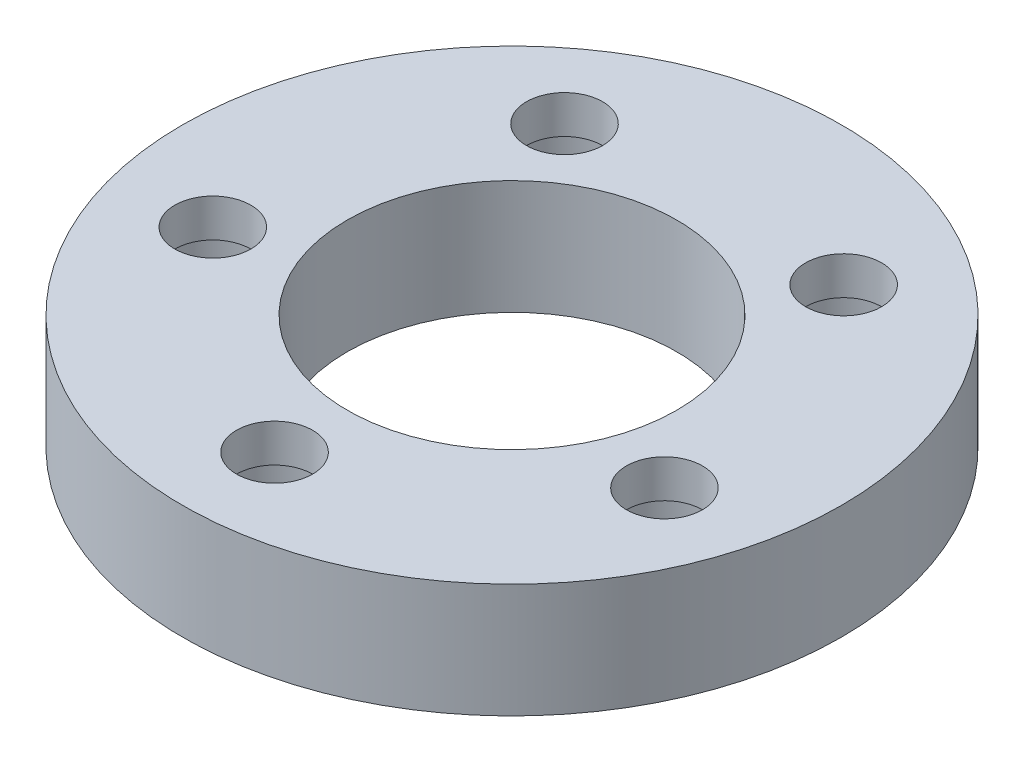
ISO-10303-21;
HEADER;
FILE_DESCRIPTION(('STEP AP214'),'2;1');
FILE_NAME('part.step','',(''),(''),'','','');
FILE_SCHEMA(('AUTOMOTIVE_DESIGN { 1 0 10303 214 1 1 1 1 }'));
ENDSEC;
DATA;
#1=APPLICATION_CONTEXT('core data for automotive mechanical design processes');
#2=APPLICATION_PROTOCOL_DEFINITION('international standard','automotive_design',2000,#1);
#3=PRODUCT_CONTEXT('',#1,'mechanical');
#4=PRODUCT('Part','Part','',(#3));
#5=PRODUCT_RELATED_PRODUCT_CATEGORY('part','',(#4));
#6=PRODUCT_DEFINITION_FORMATION('','',#4);
#7=PRODUCT_DEFINITION_CONTEXT('part definition',#1,'design');
#8=PRODUCT_DEFINITION('design','',#6,#7);
#9=PRODUCT_DEFINITION_SHAPE('','',#8);
#10=(LENGTH_UNIT() NAMED_UNIT(*) SI_UNIT(.MILLI.,.METRE.));
#11=(NAMED_UNIT(*) PLANE_ANGLE_UNIT() SI_UNIT($,.RADIAN.));
#12=(NAMED_UNIT(*) SI_UNIT($,.STERADIAN.) SOLID_ANGLE_UNIT());
#13=UNCERTAINTY_MEASURE_WITH_UNIT(LENGTH_MEASURE(1.E-05),#10,'distance_accuracy_value','');
#14=(GEOMETRIC_REPRESENTATION_CONTEXT(3) GLOBAL_UNCERTAINTY_ASSIGNED_CONTEXT((#13)) GLOBAL_UNIT_ASSIGNED_CONTEXT((#10,
#11,#12)) REPRESENTATION_CONTEXT('',''));
#15=CARTESIAN_POINT('',(0.,0.,0.));
#16=DIRECTION('',(0.,0.,1.));
#17=DIRECTION('',(1.,0.,0.));
#18=AXIS2_PLACEMENT_3D('',#15,#16,#17);
#19=CARTESIAN_POINT('',(-15.0742457832777,-25.337212190987,4.89791936084227));
#20=DIRECTION('',(0.,-1.,0.));
#21=DIRECTION('',(1.,0.,0.));
#22=AXIS2_PLACEMENT_3D('',#19,#20,#21);
#23=CYLINDRICAL_SURFACE('',#22,2.54000000000081);
#24=CARTESIAN_POINT('',(-15.0742457832777,-25.337212190987,4.89791936084227));
#25=DIRECTION('',(0.,-1.,0.));
#26=DIRECTION('',(1.,0.,0.));
#27=AXIS2_PLACEMENT_3D('',#24,#25,#26);
#28=CIRCLE('',#27,2.54000000000081);
#29=CARTESIAN_POINT('',(-12.5342457832769,-25.337212190987,4.89791936084227));
#30=VERTEX_POINT('',#29);
#31=EDGE_CURVE('E52',#30,#30,#28,.T.);
#32=CARTESIAN_POINT('',(-15.0742457832777,-27.877212190987,4.89791936084227));
#33=DIRECTION('',(0.,-1.,0.));
#34=DIRECTION('',(1.,0.,0.));
#35=AXIS2_PLACEMENT_3D('',#32,#33,#34);
#36=CIRCLE('',#35,2.54000000000081);
#37=CARTESIAN_POINT('',(-12.5342457832769,-27.877212190987,4.89791936084227));
#38=VERTEX_POINT('',#37);
#39=EDGE_CURVE('E36',#38,#38,#36,.F.);
#40=CARTESIAN_POINT('',(-12.5342457832769,-25.337212190987,4.89791936084227));
#41=CARTESIAN_POINT('',(-12.5342457832769,-25.3636705243203,4.89791936084227));
#42=CARTESIAN_POINT('',(-12.5342457832769,-25.3901288576536,4.89791936084227));
#43=CARTESIAN_POINT('',(-12.5342457832769,-25.4430455243203,4.89791936084227));
#44=CARTESIAN_POINT('',(-12.5342457832769,-25.4695038576536,4.89791936084227));
#45=CARTESIAN_POINT('',(-12.5342457832769,-25.5224205243203,4.89791936084227));
#46=CARTESIAN_POINT('',(-12.5342457832769,-25.5488788576536,4.89791936084227));
#47=CARTESIAN_POINT('',(-12.5342457832769,-25.6017955243203,4.89791936084227));
#48=CARTESIAN_POINT('',(-12.5342457832769,-25.6282538576536,4.89791936084227));
#49=CARTESIAN_POINT('',(-12.5342457832769,-25.6811705243203,4.89791936084227));
#50=CARTESIAN_POINT('',(-12.5342457832769,-25.7076288576536,4.89791936084227));
#51=CARTESIAN_POINT('',(-12.5342457832769,-25.7605455243203,4.89791936084227));
#52=CARTESIAN_POINT('',(-12.5342457832769,-25.7870038576536,4.89791936084227));
#53=CARTESIAN_POINT('',(-12.5342457832769,-25.8399205243203,4.89791936084227));
#54=CARTESIAN_POINT('',(-12.5342457832769,-25.8663788576536,4.89791936084227));
#55=CARTESIAN_POINT('',(-12.5342457832769,-25.9192955243203,4.89791936084227));
#56=CARTESIAN_POINT('',(-12.5342457832769,-25.9457538576536,4.89791936084227));
#57=CARTESIAN_POINT('',(-12.5342457832769,-25.9986705243203,4.89791936084227));
#58=CARTESIAN_POINT('',(-12.5342457832769,-26.0251288576536,4.89791936084227));
#59=CARTESIAN_POINT('',(-12.5342457832769,-26.0780455243203,4.89791936084227));
#60=CARTESIAN_POINT('',(-12.5342457832769,-26.1045038576536,4.89791936084227));
#61=CARTESIAN_POINT('',(-12.5342457832769,-26.1574205243203,4.89791936084227));
#62=CARTESIAN_POINT('',(-12.5342457832769,-26.1838788576536,4.89791936084227));
#63=CARTESIAN_POINT('',(-12.5342457832769,-26.2367955243203,4.89791936084227));
#64=CARTESIAN_POINT('',(-12.5342457832769,-26.2632538576536,4.89791936084227));
#65=CARTESIAN_POINT('',(-12.5342457832769,-26.3161705243203,4.89791936084227));
#66=CARTESIAN_POINT('',(-12.5342457832769,-26.3426288576536,4.89791936084227));
#67=CARTESIAN_POINT('',(-12.5342457832769,-26.3955455243203,4.89791936084227));
#68=CARTESIAN_POINT('',(-12.5342457832769,-26.4220038576536,4.89791936084227));
#69=CARTESIAN_POINT('',(-12.5342457832769,-26.4749205243203,4.89791936084227));
#70=CARTESIAN_POINT('',(-12.5342457832769,-26.5013788576536,4.89791936084227));
#71=CARTESIAN_POINT('',(-12.5342457832769,-26.5542955243203,4.89791936084227));
#72=CARTESIAN_POINT('',(-12.5342457832769,-26.5807538576536,4.89791936084227));
#73=CARTESIAN_POINT('',(-12.5342457832769,-26.6336705243203,4.89791936084227));
#74=CARTESIAN_POINT('',(-12.5342457832769,-26.6601288576536,4.89791936084227));
#75=CARTESIAN_POINT('',(-12.5342457832769,-26.7130455243203,4.89791936084227));
#76=CARTESIAN_POINT('',(-12.5342457832769,-26.7395038576536,4.89791936084227));
#77=CARTESIAN_POINT('',(-12.5342457832769,-26.7924205243203,4.89791936084227));
#78=CARTESIAN_POINT('',(-12.5342457832769,-26.8188788576536,4.89791936084227));
#79=CARTESIAN_POINT('',(-12.5342457832769,-26.8717955243203,4.89791936084227));
#80=CARTESIAN_POINT('',(-12.5342457832769,-26.8982538576536,4.89791936084227));
#81=CARTESIAN_POINT('',(-12.5342457832769,-26.9511705243203,4.89791936084227));
#82=CARTESIAN_POINT('',(-12.5342457832769,-26.9776288576536,4.89791936084227));
#83=CARTESIAN_POINT('',(-12.5342457832769,-27.0305455243203,4.89791936084227));
#84=CARTESIAN_POINT('',(-12.5342457832769,-27.0570038576536,4.89791936084227));
#85=CARTESIAN_POINT('',(-12.5342457832769,-27.1099205243203,4.89791936084227));
#86=CARTESIAN_POINT('',(-12.5342457832769,-27.1363788576536,4.89791936084227));
#87=CARTESIAN_POINT('',(-12.5342457832769,-27.1892955243203,4.89791936084227));
#88=CARTESIAN_POINT('',(-12.5342457832769,-27.2157538576536,4.89791936084227));
#89=CARTESIAN_POINT('',(-12.5342457832769,-27.2686705243203,4.89791936084227));
#90=CARTESIAN_POINT('',(-12.5342457832769,-27.2951288576536,4.89791936084227));
#91=CARTESIAN_POINT('',(-12.5342457832769,-27.3480455243203,4.89791936084227));
#92=CARTESIAN_POINT('',(-12.5342457832769,-27.3745038576536,4.89791936084227));
#93=CARTESIAN_POINT('',(-12.5342457832769,-27.4274205243203,4.89791936084227));
#94=CARTESIAN_POINT('',(-12.5342457832769,-27.4538788576536,4.89791936084227));
#95=CARTESIAN_POINT('',(-12.5342457832769,-27.5067955243203,4.89791936084227));
#96=CARTESIAN_POINT('',(-12.5342457832769,-27.5332538576536,4.89791936084227));
#97=CARTESIAN_POINT('',(-12.5342457832769,-27.5861705243203,4.89791936084227));
#98=CARTESIAN_POINT('',(-12.5342457832769,-27.6126288576536,4.89791936084227));
#99=CARTESIAN_POINT('',(-12.5342457832769,-27.6655455243203,4.89791936084227));
#100=CARTESIAN_POINT('',(-12.5342457832769,-27.6920038576536,4.89791936084227));
#101=CARTESIAN_POINT('',(-12.5342457832769,-27.7449205243203,4.89791936084227));
#102=CARTESIAN_POINT('',(-12.5342457832769,-27.7713788576536,4.89791936084227));
#103=CARTESIAN_POINT('',(-12.5342457832769,-27.8242955243203,4.89791936084227));
#104=CARTESIAN_POINT('',(-12.5342457832769,-27.8507538576536,4.89791936084227));
#105=CARTESIAN_POINT('',(-12.5342457832769,-27.877212190987,4.89791936084227));
#106=B_SPLINE_CURVE_WITH_KNOTS('',3,(#40,#41,#42,#43,#44,#45,#46,#47,#48,#49,#50,#51,#52,#53,
#54,#55,#56,#57,#58,#59,#60,#61,#62,#63,#64,#65,#66,#67,#68,#69,#70,#71,#72,#73,#74,#75,#76,#77,
#78,#79,#80,#81,#82,#83,#84,#85,#86,#87,#88,#89,#90,#91,#92,#93,#94,#95,#96,#97,#98,#99,#100,
#101,#102,#103,#104,#105),.UNSPECIFIED.,.F.,.F.,(4,2,2,2,2,2,2,2,2,2,2,2,2,2,2,2,2,2,2,2,2,2,2,
2,2,2,2,2,2,2,2,2,4),(0.,0.0793749999999996,0.158749999999999,0.238124999999999,
0.317499999999998,0.396874999999998,0.476249999999998,0.555624999999997,0.634999999999997,
0.714374999999996,0.793749999999996,0.873124999999999,0.952499999999998,1.031875,1.11125,
1.190625,1.27,1.349375,1.42875,1.508125,1.5875,1.66687499999999,1.74624999999999,1.825625,1.905,
1.984375,2.06375,2.143125,2.2225,2.301875,2.38124999999999,2.46062499999999,2.53999999999999),.UNSPECIFIED.);
#107=EDGE_CURVE('BSEAM32',#30,#38,#106,.T.);
#108=ORIENTED_EDGE('',*,*,#31,.F.);
#109=ORIENTED_EDGE('',*,*,#39,.F.);
#110=ORIENTED_EDGE('',*,*,#107,.T.);
#111=ORIENTED_EDGE('',*,*,#107,.F.);
#112=EDGE_LOOP('',(#108,#110,#109,#111));
#113=FACE_BOUND('',#112,.T.);
#114=ADVANCED_FACE('F32',(#113),#23,.F.);
#115=CARTESIAN_POINT('',(-9.31639624883447,-25.337212190987,-12.8229193608433));
#116=DIRECTION('',(0.,-1.,0.));
#117=DIRECTION('',(1.,0.,0.));
#118=AXIS2_PLACEMENT_3D('',#115,#116,#117);
#119=CYLINDRICAL_SURFACE('',#118,2.54000000000142);
#120=CARTESIAN_POINT('',(-9.31639624883447,-25.337212190987,-12.8229193608433));
#121=DIRECTION('',(0.,-1.,0.));
#122=DIRECTION('',(1.,0.,0.));
#123=AXIS2_PLACEMENT_3D('',#120,#121,#122);
#124=CIRCLE('',#123,2.54000000000142);
#125=CARTESIAN_POINT('',(-6.77639624883305,-25.337212190987,-12.8229193608433));
#126=VERTEX_POINT('',#125);
#127=EDGE_CURVE('E94',#126,#126,#124,.T.);
#128=CARTESIAN_POINT('',(-9.31639624883447,-27.877212190987,-12.8229193608433));
#129=DIRECTION('',(0.,-1.,0.));
#130=DIRECTION('',(1.,0.,0.));
#131=AXIS2_PLACEMENT_3D('',#128,#129,#130);
#132=CIRCLE('',#131,2.54000000000142);
#133=CARTESIAN_POINT('',(-6.77639624883305,-27.877212190987,-12.8229193608433));
#134=VERTEX_POINT('',#133);
#135=EDGE_CURVE('E63',#134,#134,#132,.F.);
#136=CARTESIAN_POINT('',(-6.77639624883305,-25.337212190987,-12.8229193608433));
#137=CARTESIAN_POINT('',(-6.77639624883305,-25.3636705243203,-12.8229193608433));
#138=CARTESIAN_POINT('',(-6.77639624883305,-25.3901288576536,-12.8229193608433));
#139=CARTESIAN_POINT('',(-6.77639624883305,-25.4430455243203,-12.8229193608433));
#140=CARTESIAN_POINT('',(-6.77639624883305,-25.4695038576536,-12.8229193608433));
#141=CARTESIAN_POINT('',(-6.77639624883305,-25.5224205243203,-12.8229193608433));
#142=CARTESIAN_POINT('',(-6.77639624883305,-25.5488788576536,-12.8229193608433));
#143=CARTESIAN_POINT('',(-6.77639624883305,-25.6017955243203,-12.8229193608433));
#144=CARTESIAN_POINT('',(-6.77639624883305,-25.6282538576536,-12.8229193608433));
#145=CARTESIAN_POINT('',(-6.77639624883305,-25.6811705243203,-12.8229193608433));
#146=CARTESIAN_POINT('',(-6.77639624883305,-25.7076288576536,-12.8229193608433));
#147=CARTESIAN_POINT('',(-6.77639624883305,-25.7605455243203,-12.8229193608433));
#148=CARTESIAN_POINT('',(-6.77639624883305,-25.7870038576536,-12.8229193608433));
#149=CARTESIAN_POINT('',(-6.77639624883305,-25.8399205243203,-12.8229193608433));
#150=CARTESIAN_POINT('',(-6.77639624883305,-25.8663788576536,-12.8229193608433));
#151=CARTESIAN_POINT('',(-6.77639624883305,-25.9192955243203,-12.8229193608433));
#152=CARTESIAN_POINT('',(-6.77639624883305,-25.9457538576536,-12.8229193608433));
#153=CARTESIAN_POINT('',(-6.77639624883305,-25.9986705243203,-12.8229193608433));
#154=CARTESIAN_POINT('',(-6.77639624883305,-26.0251288576536,-12.8229193608433));
#155=CARTESIAN_POINT('',(-6.77639624883305,-26.0780455243203,-12.8229193608433));
#156=CARTESIAN_POINT('',(-6.77639624883305,-26.1045038576536,-12.8229193608433));
#157=CARTESIAN_POINT('',(-6.77639624883305,-26.1574205243203,-12.8229193608433));
#158=CARTESIAN_POINT('',(-6.77639624883305,-26.1838788576536,-12.8229193608433));
#159=CARTESIAN_POINT('',(-6.77639624883305,-26.2367955243203,-12.8229193608433));
#160=CARTESIAN_POINT('',(-6.77639624883305,-26.2632538576536,-12.8229193608433));
#161=CARTESIAN_POINT('',(-6.77639624883305,-26.3161705243203,-12.8229193608433));
#162=CARTESIAN_POINT('',(-6.77639624883305,-26.3426288576536,-12.8229193608433));
#163=CARTESIAN_POINT('',(-6.77639624883305,-26.3955455243203,-12.8229193608433));
#164=CARTESIAN_POINT('',(-6.77639624883305,-26.4220038576536,-12.8229193608433));
#165=CARTESIAN_POINT('',(-6.77639624883305,-26.4749205243203,-12.8229193608433));
#166=CARTESIAN_POINT('',(-6.77639624883305,-26.5013788576536,-12.8229193608433));
#167=CARTESIAN_POINT('',(-6.77639624883305,-26.5542955243203,-12.8229193608433));
#168=CARTESIAN_POINT('',(-6.77639624883305,-26.5807538576536,-12.8229193608433));
#169=CARTESIAN_POINT('',(-6.77639624883305,-26.6336705243203,-12.8229193608433));
#170=CARTESIAN_POINT('',(-6.77639624883305,-26.6601288576536,-12.8229193608433));
#171=CARTESIAN_POINT('',(-6.77639624883305,-26.7130455243203,-12.8229193608433));
#172=CARTESIAN_POINT('',(-6.77639624883305,-26.7395038576536,-12.8229193608433));
#173=CARTESIAN_POINT('',(-6.77639624883305,-26.7924205243203,-12.8229193608433));
#174=CARTESIAN_POINT('',(-6.77639624883305,-26.8188788576536,-12.8229193608433));
#175=CARTESIAN_POINT('',(-6.77639624883305,-26.8717955243203,-12.8229193608433));
#176=CARTESIAN_POINT('',(-6.77639624883305,-26.8982538576536,-12.8229193608433));
#177=CARTESIAN_POINT('',(-6.77639624883305,-26.9511705243203,-12.8229193608433));
#178=CARTESIAN_POINT('',(-6.77639624883305,-26.9776288576536,-12.8229193608433));
#179=CARTESIAN_POINT('',(-6.77639624883305,-27.0305455243203,-12.8229193608433));
#180=CARTESIAN_POINT('',(-6.77639624883305,-27.0570038576536,-12.8229193608433));
#181=CARTESIAN_POINT('',(-6.77639624883305,-27.1099205243203,-12.8229193608433));
#182=CARTESIAN_POINT('',(-6.77639624883305,-27.1363788576536,-12.8229193608433));
#183=CARTESIAN_POINT('',(-6.77639624883305,-27.1892955243203,-12.8229193608433));
#184=CARTESIAN_POINT('',(-6.77639624883305,-27.2157538576536,-12.8229193608433));
#185=CARTESIAN_POINT('',(-6.77639624883305,-27.2686705243203,-12.8229193608433));
#186=CARTESIAN_POINT('',(-6.77639624883305,-27.2951288576536,-12.8229193608433));
#187=CARTESIAN_POINT('',(-6.77639624883305,-27.3480455243203,-12.8229193608433));
#188=CARTESIAN_POINT('',(-6.77639624883305,-27.3745038576536,-12.8229193608433));
#189=CARTESIAN_POINT('',(-6.77639624883305,-27.4274205243203,-12.8229193608433));
#190=CARTESIAN_POINT('',(-6.77639624883305,-27.4538788576536,-12.8229193608433));
#191=CARTESIAN_POINT('',(-6.77639624883305,-27.5067955243203,-12.8229193608433));
#192=CARTESIAN_POINT('',(-6.77639624883305,-27.5332538576536,-12.8229193608433));
#193=CARTESIAN_POINT('',(-6.77639624883305,-27.5861705243203,-12.8229193608433));
#194=CARTESIAN_POINT('',(-6.77639624883305,-27.6126288576536,-12.8229193608433));
#195=CARTESIAN_POINT('',(-6.77639624883305,-27.6655455243203,-12.8229193608433));
#196=CARTESIAN_POINT('',(-6.77639624883305,-27.6920038576536,-12.8229193608433));
#197=CARTESIAN_POINT('',(-6.77639624883305,-27.7449205243203,-12.8229193608433));
#198=CARTESIAN_POINT('',(-6.77639624883305,-27.7713788576536,-12.8229193608433));
#199=CARTESIAN_POINT('',(-6.77639624883305,-27.8242955243203,-12.8229193608433));
#200=CARTESIAN_POINT('',(-6.77639624883305,-27.8507538576536,-12.8229193608433));
#201=CARTESIAN_POINT('',(-6.77639624883305,-27.877212190987,-12.8229193608433));
#202=B_SPLINE_CURVE_WITH_KNOTS('',3,(#136,#137,#138,#139,#140,#141,#142,#143,#144,#145,#146,
#147,#148,#149,#150,#151,#152,#153,#154,#155,#156,#157,#158,#159,#160,#161,#162,#163,#164,#165,
#166,#167,#168,#169,#170,#171,#172,#173,#174,#175,#176,#177,#178,#179,#180,#181,#182,#183,#184,
#185,#186,#187,#188,#189,#190,#191,#192,#193,#194,#195,#196,#197,#198,#199,#200,#201),
.UNSPECIFIED.,.F.,.F.,(4,2,2,2,2,2,2,2,2,2,2,2,2,2,2,2,2,2,2,2,2,2,2,2,2,2,2,2,2,2,2,2,4),(0.,
0.0793749999999996,0.158749999999999,0.238124999999999,0.317499999999998,0.396874999999998,
0.476249999999998,0.555624999999997,0.634999999999997,0.714374999999996,0.793749999999996,
0.873124999999999,0.952499999999998,1.031875,1.11125,1.190625,1.27,1.349375,1.42875,1.508125,
1.5875,1.66687499999999,1.74624999999999,1.825625,1.905,1.984375,2.06375,2.143125,2.2225,
2.301875,2.38124999999999,2.46062499999999,2.53999999999999),.UNSPECIFIED.);
#203=EDGE_CURVE('BSEAM129',#126,#134,#202,.T.);
#204=ORIENTED_EDGE('',*,*,#127,.F.);
#205=ORIENTED_EDGE('',*,*,#135,.F.);
#206=ORIENTED_EDGE('',*,*,#203,.T.);
#207=ORIENTED_EDGE('',*,*,#203,.F.);
#208=EDGE_LOOP('',(#204,#206,#205,#207));
#209=FACE_BOUND('',#208,.T.);
#210=ADVANCED_FACE('F129',(#209),#119,.F.);
#211=CARTESIAN_POINT('',(9.31639624883691,-25.337212190987,-12.8229193608425));
#212=DIRECTION('',(0.,-1.,0.));
#213=DIRECTION('',(1.,0.,0.));
#214=AXIS2_PLACEMENT_3D('',#211,#212,#213);
#215=CYLINDRICAL_SURFACE('',#214,2.54000000000114);
#216=CARTESIAN_POINT('',(9.31639624883691,-25.337212190987,-12.8229193608425));
#217=DIRECTION('',(0.,-1.,0.));
#218=DIRECTION('',(1.,0.,0.));
#219=AXIS2_PLACEMENT_3D('',#216,#217,#218);
#220=CIRCLE('',#219,2.54000000000114);
#221=CARTESIAN_POINT('',(11.856396248838,-25.337212190987,-12.8229193608425));
#222=VERTEX_POINT('',#221);
#223=EDGE_CURVE('E97',#222,#222,#220,.T.);
#224=CARTESIAN_POINT('',(9.31639624883691,-27.877212190987,-12.8229193608425));
#225=DIRECTION('',(0.,-1.,0.));
#226=DIRECTION('',(1.,0.,0.));
#227=AXIS2_PLACEMENT_3D('',#224,#225,#226);
#228=CIRCLE('',#227,2.54000000000114);
#229=CARTESIAN_POINT('',(11.856396248838,-27.877212190987,-12.8229193608425));
#230=VERTEX_POINT('',#229);
#231=EDGE_CURVE('E59',#230,#230,#228,.F.);
#232=CARTESIAN_POINT('',(11.856396248838,-25.337212190987,-12.8229193608425));
#233=CARTESIAN_POINT('',(11.856396248838,-25.3636705243203,-12.8229193608425));
#234=CARTESIAN_POINT('',(11.856396248838,-25.3901288576536,-12.8229193608425));
#235=CARTESIAN_POINT('',(11.856396248838,-25.4430455243203,-12.8229193608425));
#236=CARTESIAN_POINT('',(11.856396248838,-25.4695038576536,-12.8229193608425));
#237=CARTESIAN_POINT('',(11.856396248838,-25.5224205243203,-12.8229193608425));
#238=CARTESIAN_POINT('',(11.856396248838,-25.5488788576536,-12.8229193608425));
#239=CARTESIAN_POINT('',(11.856396248838,-25.6017955243203,-12.8229193608425));
#240=CARTESIAN_POINT('',(11.856396248838,-25.6282538576536,-12.8229193608425));
#241=CARTESIAN_POINT('',(11.856396248838,-25.6811705243203,-12.8229193608425));
#242=CARTESIAN_POINT('',(11.856396248838,-25.7076288576536,-12.8229193608425));
#243=CARTESIAN_POINT('',(11.856396248838,-25.7605455243203,-12.8229193608425));
#244=CARTESIAN_POINT('',(11.856396248838,-25.7870038576536,-12.8229193608425));
#245=CARTESIAN_POINT('',(11.856396248838,-25.8399205243203,-12.8229193608425));
#246=CARTESIAN_POINT('',(11.856396248838,-25.8663788576536,-12.8229193608425));
#247=CARTESIAN_POINT('',(11.856396248838,-25.9192955243203,-12.8229193608425));
#248=CARTESIAN_POINT('',(11.856396248838,-25.9457538576536,-12.8229193608425));
#249=CARTESIAN_POINT('',(11.856396248838,-25.9986705243203,-12.8229193608425));
#250=CARTESIAN_POINT('',(11.856396248838,-26.0251288576536,-12.8229193608425));
#251=CARTESIAN_POINT('',(11.856396248838,-26.0780455243203,-12.8229193608425));
#252=CARTESIAN_POINT('',(11.856396248838,-26.1045038576536,-12.8229193608425));
#253=CARTESIAN_POINT('',(11.856396248838,-26.1574205243203,-12.8229193608425));
#254=CARTESIAN_POINT('',(11.856396248838,-26.1838788576536,-12.8229193608425));
#255=CARTESIAN_POINT('',(11.856396248838,-26.2367955243203,-12.8229193608425));
#256=CARTESIAN_POINT('',(11.856396248838,-26.2632538576536,-12.8229193608425));
#257=CARTESIAN_POINT('',(11.856396248838,-26.3161705243203,-12.8229193608425));
#258=CARTESIAN_POINT('',(11.856396248838,-26.3426288576536,-12.8229193608425));
#259=CARTESIAN_POINT('',(11.856396248838,-26.3955455243203,-12.8229193608425));
#260=CARTESIAN_POINT('',(11.856396248838,-26.4220038576536,-12.8229193608425));
#261=CARTESIAN_POINT('',(11.856396248838,-26.4749205243203,-12.8229193608425));
#262=CARTESIAN_POINT('',(11.856396248838,-26.5013788576536,-12.8229193608425));
#263=CARTESIAN_POINT('',(11.856396248838,-26.5542955243203,-12.8229193608425));
#264=CARTESIAN_POINT('',(11.856396248838,-26.5807538576536,-12.8229193608425));
#265=CARTESIAN_POINT('',(11.856396248838,-26.6336705243203,-12.8229193608425));
#266=CARTESIAN_POINT('',(11.856396248838,-26.6601288576536,-12.8229193608425));
#267=CARTESIAN_POINT('',(11.856396248838,-26.7130455243203,-12.8229193608425));
#268=CARTESIAN_POINT('',(11.856396248838,-26.7395038576536,-12.8229193608425));
#269=CARTESIAN_POINT('',(11.856396248838,-26.7924205243203,-12.8229193608425));
#270=CARTESIAN_POINT('',(11.856396248838,-26.8188788576536,-12.8229193608425));
#271=CARTESIAN_POINT('',(11.856396248838,-26.8717955243203,-12.8229193608425));
#272=CARTESIAN_POINT('',(11.856396248838,-26.8982538576536,-12.8229193608425));
#273=CARTESIAN_POINT('',(11.856396248838,-26.9511705243203,-12.8229193608425));
#274=CARTESIAN_POINT('',(11.856396248838,-26.9776288576536,-12.8229193608425));
#275=CARTESIAN_POINT('',(11.856396248838,-27.0305455243203,-12.8229193608425));
#276=CARTESIAN_POINT('',(11.856396248838,-27.0570038576536,-12.8229193608425));
#277=CARTESIAN_POINT('',(11.856396248838,-27.1099205243203,-12.8229193608425));
#278=CARTESIAN_POINT('',(11.856396248838,-27.1363788576536,-12.8229193608425));
#279=CARTESIAN_POINT('',(11.856396248838,-27.1892955243203,-12.8229193608425));
#280=CARTESIAN_POINT('',(11.856396248838,-27.2157538576536,-12.8229193608425));
#281=CARTESIAN_POINT('',(11.856396248838,-27.2686705243203,-12.8229193608425));
#282=CARTESIAN_POINT('',(11.856396248838,-27.2951288576536,-12.8229193608425));
#283=CARTESIAN_POINT('',(11.856396248838,-27.3480455243203,-12.8229193608425));
#284=CARTESIAN_POINT('',(11.856396248838,-27.3745038576536,-12.8229193608425));
#285=CARTESIAN_POINT('',(11.856396248838,-27.4274205243203,-12.8229193608425));
#286=CARTESIAN_POINT('',(11.856396248838,-27.4538788576536,-12.8229193608425));
#287=CARTESIAN_POINT('',(11.856396248838,-27.5067955243203,-12.8229193608425));
#288=CARTESIAN_POINT('',(11.856396248838,-27.5332538576536,-12.8229193608425));
#289=CARTESIAN_POINT('',(11.856396248838,-27.5861705243203,-12.8229193608425));
#290=CARTESIAN_POINT('',(11.856396248838,-27.6126288576536,-12.8229193608425));
#291=CARTESIAN_POINT('',(11.856396248838,-27.6655455243203,-12.8229193608425));
#292=CARTESIAN_POINT('',(11.856396248838,-27.6920038576536,-12.8229193608425));
#293=CARTESIAN_POINT('',(11.856396248838,-27.7449205243203,-12.8229193608425));
#294=CARTESIAN_POINT('',(11.856396248838,-27.7713788576536,-12.8229193608425));
#295=CARTESIAN_POINT('',(11.856396248838,-27.8242955243203,-12.8229193608425));
#296=CARTESIAN_POINT('',(11.856396248838,-27.8507538576536,-12.8229193608425));
#297=CARTESIAN_POINT('',(11.856396248838,-27.877212190987,-12.8229193608425));
#298=B_SPLINE_CURVE_WITH_KNOTS('',3,(#232,#233,#234,#235,#236,#237,#238,#239,#240,#241,#242,
#243,#244,#245,#246,#247,#248,#249,#250,#251,#252,#253,#254,#255,#256,#257,#258,#259,#260,#261,
#262,#263,#264,#265,#266,#267,#268,#269,#270,#271,#272,#273,#274,#275,#276,#277,#278,#279,#280,
#281,#282,#283,#284,#285,#286,#287,#288,#289,#290,#291,#292,#293,#294,#295,#296,#297),
.UNSPECIFIED.,.F.,.F.,(4,2,2,2,2,2,2,2,2,2,2,2,2,2,2,2,2,2,2,2,2,2,2,2,2,2,2,2,2,2,2,2,4),(0.,
0.0793749999999996,0.158749999999999,0.238124999999999,0.317499999999998,0.396874999999998,
0.476249999999998,0.555624999999997,0.634999999999997,0.714374999999996,0.793749999999996,
0.873124999999999,0.952499999999998,1.031875,1.11125,1.190625,1.27,1.349375,1.42875,1.508125,
1.5875,1.66687499999999,1.74624999999999,1.825625,1.905,1.984375,2.06375,2.143125,2.2225,
2.301875,2.38124999999999,2.46062499999999,2.53999999999999),.UNSPECIFIED.);
#299=EDGE_CURVE('BSEAM135',#222,#230,#298,.T.);
#300=ORIENTED_EDGE('',*,*,#223,.F.);
#301=ORIENTED_EDGE('',*,*,#231,.F.);
#302=ORIENTED_EDGE('',*,*,#299,.T.);
#303=ORIENTED_EDGE('',*,*,#299,.F.);
#304=EDGE_LOOP('',(#300,#302,#301,#303));
#305=FACE_BOUND('',#304,.T.);
#306=ADVANCED_FACE('F135',(#305),#215,.F.);
#307=CARTESIAN_POINT('',(15.0742457832786,-25.337212190987,4.89791936084355));
#308=DIRECTION('',(0.,-1.,0.));
#309=DIRECTION('',(1.,0.,0.));
#310=AXIS2_PLACEMENT_3D('',#307,#308,#309);
#311=CYLINDRICAL_SURFACE('',#310,2.5400000000003);
#312=CARTESIAN_POINT('',(15.0742457832786,-25.337212190987,4.89791936084355));
#313=DIRECTION('',(0.,-1.,0.));
#314=DIRECTION('',(1.,0.,0.));
#315=AXIS2_PLACEMENT_3D('',#312,#313,#314);
#316=CIRCLE('',#315,2.5400000000003);
#317=CARTESIAN_POINT('',(17.6142457832789,-25.337212190987,4.89791936084355));
#318=VERTEX_POINT('',#317);
#319=EDGE_CURVE('E100',#318,#318,#316,.T.);
#320=CARTESIAN_POINT('',(15.0742457832786,-27.877212190987,4.89791936084355));
#321=DIRECTION('',(0.,-1.,0.));
#322=DIRECTION('',(1.,0.,0.));
#323=AXIS2_PLACEMENT_3D('',#320,#321,#322);
#324=CIRCLE('',#323,2.5400000000003);
#325=CARTESIAN_POINT('',(17.6142457832789,-27.877212190987,4.89791936084355));
#326=VERTEX_POINT('',#325);
#327=EDGE_CURVE('E54',#326,#326,#324,.F.);
#328=CARTESIAN_POINT('',(17.6142457832789,-25.337212190987,4.89791936084355));
#329=CARTESIAN_POINT('',(17.6142457832789,-25.3636705243203,4.89791936084355));
#330=CARTESIAN_POINT('',(17.6142457832789,-25.3901288576536,4.89791936084355));
#331=CARTESIAN_POINT('',(17.6142457832789,-25.4430455243203,4.89791936084355));
#332=CARTESIAN_POINT('',(17.6142457832789,-25.4695038576536,4.89791936084355));
#333=CARTESIAN_POINT('',(17.6142457832789,-25.5224205243203,4.89791936084355));
#334=CARTESIAN_POINT('',(17.6142457832789,-25.5488788576536,4.89791936084355));
#335=CARTESIAN_POINT('',(17.6142457832789,-25.6017955243203,4.89791936084355));
#336=CARTESIAN_POINT('',(17.6142457832789,-25.6282538576536,4.89791936084355));
#337=CARTESIAN_POINT('',(17.6142457832789,-25.6811705243203,4.89791936084355));
#338=CARTESIAN_POINT('',(17.6142457832789,-25.7076288576536,4.89791936084355));
#339=CARTESIAN_POINT('',(17.6142457832789,-25.7605455243203,4.89791936084355));
#340=CARTESIAN_POINT('',(17.6142457832789,-25.7870038576536,4.89791936084355));
#341=CARTESIAN_POINT('',(17.6142457832789,-25.8399205243203,4.89791936084355));
#342=CARTESIAN_POINT('',(17.6142457832789,-25.8663788576536,4.89791936084355));
#343=CARTESIAN_POINT('',(17.6142457832789,-25.9192955243203,4.89791936084355));
#344=CARTESIAN_POINT('',(17.6142457832789,-25.9457538576536,4.89791936084355));
#345=CARTESIAN_POINT('',(17.6142457832789,-25.9986705243203,4.89791936084355));
#346=CARTESIAN_POINT('',(17.6142457832789,-26.0251288576536,4.89791936084355));
#347=CARTESIAN_POINT('',(17.6142457832789,-26.0780455243203,4.89791936084355));
#348=CARTESIAN_POINT('',(17.6142457832789,-26.1045038576536,4.89791936084355));
#349=CARTESIAN_POINT('',(17.6142457832789,-26.1574205243203,4.89791936084355));
#350=CARTESIAN_POINT('',(17.6142457832789,-26.1838788576536,4.89791936084355));
#351=CARTESIAN_POINT('',(17.6142457832789,-26.2367955243203,4.89791936084355));
#352=CARTESIAN_POINT('',(17.6142457832789,-26.2632538576536,4.89791936084355));
#353=CARTESIAN_POINT('',(17.6142457832789,-26.3161705243203,4.89791936084355));
#354=CARTESIAN_POINT('',(17.6142457832789,-26.3426288576536,4.89791936084355));
#355=CARTESIAN_POINT('',(17.6142457832789,-26.3955455243203,4.89791936084355));
#356=CARTESIAN_POINT('',(17.6142457832789,-26.4220038576536,4.89791936084355));
#357=CARTESIAN_POINT('',(17.6142457832789,-26.4749205243203,4.89791936084355));
#358=CARTESIAN_POINT('',(17.6142457832789,-26.5013788576536,4.89791936084355));
#359=CARTESIAN_POINT('',(17.6142457832789,-26.5542955243203,4.89791936084355));
#360=CARTESIAN_POINT('',(17.6142457832789,-26.5807538576536,4.89791936084355));
#361=CARTESIAN_POINT('',(17.6142457832789,-26.6336705243203,4.89791936084355));
#362=CARTESIAN_POINT('',(17.6142457832789,-26.6601288576536,4.89791936084355));
#363=CARTESIAN_POINT('',(17.6142457832789,-26.7130455243203,4.89791936084355));
#364=CARTESIAN_POINT('',(17.6142457832789,-26.7395038576536,4.89791936084355));
#365=CARTESIAN_POINT('',(17.6142457832789,-26.7924205243203,4.89791936084355));
#366=CARTESIAN_POINT('',(17.6142457832789,-26.8188788576536,4.89791936084355));
#367=CARTESIAN_POINT('',(17.6142457832789,-26.8717955243203,4.89791936084355));
#368=CARTESIAN_POINT('',(17.6142457832789,-26.8982538576536,4.89791936084355));
#369=CARTESIAN_POINT('',(17.6142457832789,-26.9511705243203,4.89791936084355));
#370=CARTESIAN_POINT('',(17.6142457832789,-26.9776288576536,4.89791936084355));
#371=CARTESIAN_POINT('',(17.6142457832789,-27.0305455243203,4.89791936084355));
#372=CARTESIAN_POINT('',(17.6142457832789,-27.0570038576536,4.89791936084355));
#373=CARTESIAN_POINT('',(17.6142457832789,-27.1099205243203,4.89791936084355));
#374=CARTESIAN_POINT('',(17.6142457832789,-27.1363788576536,4.89791936084355));
#375=CARTESIAN_POINT('',(17.6142457832789,-27.1892955243203,4.89791936084355));
#376=CARTESIAN_POINT('',(17.6142457832789,-27.2157538576536,4.89791936084355));
#377=CARTESIAN_POINT('',(17.6142457832789,-27.2686705243203,4.89791936084355));
#378=CARTESIAN_POINT('',(17.6142457832789,-27.2951288576536,4.89791936084355));
#379=CARTESIAN_POINT('',(17.6142457832789,-27.3480455243203,4.89791936084355));
#380=CARTESIAN_POINT('',(17.6142457832789,-27.3745038576536,4.89791936084355));
#381=CARTESIAN_POINT('',(17.6142457832789,-27.4274205243203,4.89791936084355));
#382=CARTESIAN_POINT('',(17.6142457832789,-27.4538788576536,4.89791936084355));
#383=CARTESIAN_POINT('',(17.6142457832789,-27.5067955243203,4.89791936084355));
#384=CARTESIAN_POINT('',(17.6142457832789,-27.5332538576536,4.89791936084355));
#385=CARTESIAN_POINT('',(17.6142457832789,-27.5861705243203,4.89791936084355));
#386=CARTESIAN_POINT('',(17.6142457832789,-27.6126288576536,4.89791936084355));
#387=CARTESIAN_POINT('',(17.6142457832789,-27.6655455243203,4.89791936084355));
#388=CARTESIAN_POINT('',(17.6142457832789,-27.6920038576536,4.89791936084355));
#389=CARTESIAN_POINT('',(17.6142457832789,-27.7449205243203,4.89791936084355));
#390=CARTESIAN_POINT('',(17.6142457832789,-27.7713788576536,4.89791936084355));
#391=CARTESIAN_POINT('',(17.6142457832789,-27.8242955243203,4.89791936084355));
#392=CARTESIAN_POINT('',(17.6142457832789,-27.8507538576536,4.89791936084355));
#393=CARTESIAN_POINT('',(17.6142457832789,-27.877212190987,4.89791936084355));
#394=B_SPLINE_CURVE_WITH_KNOTS('',3,(#328,#329,#330,#331,#332,#333,#334,#335,#336,#337,#338,
#339,#340,#341,#342,#343,#344,#345,#346,#347,#348,#349,#350,#351,#352,#353,#354,#355,#356,#357,
#358,#359,#360,#361,#362,#363,#364,#365,#366,#367,#368,#369,#370,#371,#372,#373,#374,#375,#376,
#377,#378,#379,#380,#381,#382,#383,#384,#385,#386,#387,#388,#389,#390,#391,#392,#393),
.UNSPECIFIED.,.F.,.F.,(4,2,2,2,2,2,2,2,2,2,2,2,2,2,2,2,2,2,2,2,2,2,2,2,2,2,2,2,2,2,2,2,4),(0.,
0.0793749999999996,0.158749999999999,0.238124999999999,0.317499999999998,0.396874999999998,
0.476249999999998,0.555624999999997,0.634999999999997,0.714374999999996,0.793749999999996,
0.873124999999999,0.952499999999998,1.031875,1.11125,1.190625,1.27,1.349375,1.42875,1.508125,
1.5875,1.66687499999999,1.74624999999999,1.825625,1.905,1.984375,2.06375,2.143125,2.2225,
2.301875,2.38124999999999,2.46062499999999,2.53999999999999),.UNSPECIFIED.);
#395=EDGE_CURVE('BSEAM146',#318,#326,#394,.T.);
#396=ORIENTED_EDGE('',*,*,#319,.F.);
#397=ORIENTED_EDGE('',*,*,#327,.F.);
#398=ORIENTED_EDGE('',*,*,#395,.T.);
#399=ORIENTED_EDGE('',*,*,#395,.F.);
#400=EDGE_LOOP('',(#396,#398,#397,#399));
#401=FACE_BOUND('',#400,.T.);
#402=ADVANCED_FACE('F146',(#401),#311,.F.);
#403=CARTESIAN_POINT('',(0.,-25.337212190987,15.85));
#404=DIRECTION('',(0.,-1.,0.));
#405=DIRECTION('',(1.,0.,0.));
#406=AXIS2_PLACEMENT_3D('',#403,#404,#405);
#407=CYLINDRICAL_SURFACE('',#406,2.54);
#408=CARTESIAN_POINT('',(0.,-25.337212190987,15.85));
#409=DIRECTION('',(0.,-1.,0.));
#410=DIRECTION('',(1.,0.,0.));
#411=AXIS2_PLACEMENT_3D('',#408,#409,#410);
#412=CIRCLE('',#411,2.54);
#413=CARTESIAN_POINT('',(2.54,-25.337212190987,15.85));
#414=VERTEX_POINT('',#413);
#415=EDGE_CURVE('E103',#414,#414,#412,.T.);
#416=CARTESIAN_POINT('',(0.,-27.877212190987,15.85));
#417=DIRECTION('',(0.,-1.,0.));
#418=DIRECTION('',(1.,0.,0.));
#419=AXIS2_PLACEMENT_3D('',#416,#417,#418);
#420=CIRCLE('',#419,2.54);
#421=CARTESIAN_POINT('',(2.54,-27.877212190987,15.85));
#422=VERTEX_POINT('',#421);
#423=EDGE_CURVE('E49',#422,#422,#420,.F.);
#424=CARTESIAN_POINT('',(2.54,-25.337212190987,15.85));
#425=CARTESIAN_POINT('',(2.54,-25.3636705243203,15.85));
#426=CARTESIAN_POINT('',(2.54,-25.3901288576536,15.85));
#427=CARTESIAN_POINT('',(2.54,-25.4430455243203,15.85));
#428=CARTESIAN_POINT('',(2.54,-25.4695038576536,15.85));
#429=CARTESIAN_POINT('',(2.54,-25.5224205243203,15.85));
#430=CARTESIAN_POINT('',(2.54,-25.5488788576536,15.85));
#431=CARTESIAN_POINT('',(2.54,-25.6017955243203,15.85));
#432=CARTESIAN_POINT('',(2.54,-25.6282538576536,15.85));
#433=CARTESIAN_POINT('',(2.54,-25.6811705243203,15.85));
#434=CARTESIAN_POINT('',(2.54,-25.7076288576536,15.85));
#435=CARTESIAN_POINT('',(2.54,-25.7605455243203,15.85));
#436=CARTESIAN_POINT('',(2.54,-25.7870038576536,15.85));
#437=CARTESIAN_POINT('',(2.54,-25.8399205243203,15.85));
#438=CARTESIAN_POINT('',(2.54,-25.8663788576536,15.85));
#439=CARTESIAN_POINT('',(2.54,-25.9192955243203,15.85));
#440=CARTESIAN_POINT('',(2.54,-25.9457538576536,15.85));
#441=CARTESIAN_POINT('',(2.54,-25.9986705243203,15.85));
#442=CARTESIAN_POINT('',(2.54,-26.0251288576536,15.85));
#443=CARTESIAN_POINT('',(2.54,-26.0780455243203,15.85));
#444=CARTESIAN_POINT('',(2.54,-26.1045038576536,15.85));
#445=CARTESIAN_POINT('',(2.54,-26.1574205243203,15.85));
#446=CARTESIAN_POINT('',(2.54,-26.1838788576536,15.85));
#447=CARTESIAN_POINT('',(2.54,-26.2367955243203,15.85));
#448=CARTESIAN_POINT('',(2.54,-26.2632538576536,15.85));
#449=CARTESIAN_POINT('',(2.54,-26.3161705243203,15.85));
#450=CARTESIAN_POINT('',(2.54,-26.3426288576536,15.85));
#451=CARTESIAN_POINT('',(2.54,-26.3955455243203,15.85));
#452=CARTESIAN_POINT('',(2.54,-26.4220038576536,15.85));
#453=CARTESIAN_POINT('',(2.54,-26.4749205243203,15.85));
#454=CARTESIAN_POINT('',(2.54,-26.5013788576536,15.85));
#455=CARTESIAN_POINT('',(2.54,-26.5542955243203,15.85));
#456=CARTESIAN_POINT('',(2.54,-26.5807538576536,15.85));
#457=CARTESIAN_POINT('',(2.54,-26.6336705243203,15.85));
#458=CARTESIAN_POINT('',(2.54,-26.6601288576536,15.85));
#459=CARTESIAN_POINT('',(2.54,-26.7130455243203,15.85));
#460=CARTESIAN_POINT('',(2.54,-26.7395038576536,15.85));
#461=CARTESIAN_POINT('',(2.54,-26.7924205243203,15.85));
#462=CARTESIAN_POINT('',(2.54,-26.8188788576536,15.85));
#463=CARTESIAN_POINT('',(2.54,-26.8717955243203,15.85));
#464=CARTESIAN_POINT('',(2.54,-26.8982538576536,15.85));
#465=CARTESIAN_POINT('',(2.54,-26.9511705243203,15.85));
#466=CARTESIAN_POINT('',(2.54,-26.9776288576536,15.85));
#467=CARTESIAN_POINT('',(2.54,-27.0305455243203,15.85));
#468=CARTESIAN_POINT('',(2.54,-27.0570038576536,15.85));
#469=CARTESIAN_POINT('',(2.54,-27.1099205243203,15.85));
#470=CARTESIAN_POINT('',(2.54,-27.1363788576536,15.85));
#471=CARTESIAN_POINT('',(2.54,-27.1892955243203,15.85));
#472=CARTESIAN_POINT('',(2.54,-27.2157538576536,15.85));
#473=CARTESIAN_POINT('',(2.54,-27.2686705243203,15.85));
#474=CARTESIAN_POINT('',(2.54,-27.2951288576536,15.85));
#475=CARTESIAN_POINT('',(2.54,-27.3480455243203,15.85));
#476=CARTESIAN_POINT('',(2.54,-27.3745038576536,15.85));
#477=CARTESIAN_POINT('',(2.54,-27.4274205243203,15.85));
#478=CARTESIAN_POINT('',(2.54,-27.4538788576536,15.85));
#479=CARTESIAN_POINT('',(2.54,-27.5067955243203,15.85));
#480=CARTESIAN_POINT('',(2.54,-27.5332538576536,15.85));
#481=CARTESIAN_POINT('',(2.54,-27.5861705243203,15.85));
#482=CARTESIAN_POINT('',(2.54,-27.6126288576536,15.85));
#483=CARTESIAN_POINT('',(2.54,-27.6655455243203,15.85));
#484=CARTESIAN_POINT('',(2.54,-27.6920038576536,15.85));
#485=CARTESIAN_POINT('',(2.54,-27.7449205243203,15.85));
#486=CARTESIAN_POINT('',(2.54,-27.7713788576536,15.85));
#487=CARTESIAN_POINT('',(2.54,-27.8242955243203,15.85));
#488=CARTESIAN_POINT('',(2.54,-27.8507538576536,15.85));
#489=CARTESIAN_POINT('',(2.54,-27.877212190987,15.85));
#490=B_SPLINE_CURVE_WITH_KNOTS('',3,(#424,#425,#426,#427,#428,#429,#430,#431,#432,#433,#434,
#435,#436,#437,#438,#439,#440,#441,#442,#443,#444,#445,#446,#447,#448,#449,#450,#451,#452,#453,
#454,#455,#456,#457,#458,#459,#460,#461,#462,#463,#464,#465,#466,#467,#468,#469,#470,#471,#472,
#473,#474,#475,#476,#477,#478,#479,#480,#481,#482,#483,#484,#485,#486,#487,#488,#489),
.UNSPECIFIED.,.F.,.F.,(4,2,2,2,2,2,2,2,2,2,2,2,2,2,2,2,2,2,2,2,2,2,2,2,2,2,2,2,2,2,2,2,4),(0.,
0.0793749999999996,0.158749999999999,0.238124999999999,0.317499999999998,0.396874999999998,
0.476249999999998,0.555624999999997,0.634999999999997,0.714374999999996,0.793749999999996,
0.873124999999999,0.952499999999998,1.031875,1.11125,1.190625,1.27,1.349375,1.42875,1.508125,
1.5875,1.66687499999999,1.74624999999999,1.825625,1.905,1.984375,2.06375,2.143125,2.2225,
2.301875,2.38124999999999,2.46062499999999,2.53999999999999),.UNSPECIFIED.);
#491=EDGE_CURVE('BSEAM150',#414,#422,#490,.T.);
#492=ORIENTED_EDGE('',*,*,#415,.F.);
#493=ORIENTED_EDGE('',*,*,#423,.F.);
#494=ORIENTED_EDGE('',*,*,#491,.T.);
#495=ORIENTED_EDGE('',*,*,#491,.F.);
#496=EDGE_LOOP('',(#492,#494,#493,#495));
#497=FACE_BOUND('',#496,.T.);
#498=ADVANCED_FACE('F150',(#497),#407,.F.);
#499=CARTESIAN_POINT('',(0.,-25.337212190987,0.));
#500=DIRECTION('',(0.,-1.,0.));
#501=DIRECTION('',(1.,0.,0.));
#502=AXIS2_PLACEMENT_3D('',#499,#500,#501);
#503=PLANE('',#502);
#504=ORIENTED_EDGE('',*,*,#31,.T.);
#505=EDGE_LOOP('',(#504));
#506=FACE_BOUND('',#505,.T.);
#507=ORIENTED_EDGE('',*,*,#127,.T.);
#508=EDGE_LOOP('',(#507));
#509=FACE_BOUND('',#508,.T.);
#510=ORIENTED_EDGE('',*,*,#223,.T.);
#511=EDGE_LOOP('',(#510));
#512=FACE_BOUND('',#511,.T.);
#513=ORIENTED_EDGE('',*,*,#319,.T.);
#514=EDGE_LOOP('',(#513));
#515=FACE_BOUND('',#514,.T.);
#516=ORIENTED_EDGE('',*,*,#415,.T.);
#517=EDGE_LOOP('',(#516));
#518=FACE_BOUND('',#517,.T.);
#519=CARTESIAN_POINT('',(9.54394253742669E-13,-25.337212190987,0.));
#520=DIRECTION('',(0.,1.,0.));
#521=DIRECTION('',(-1.,0.,0.));
#522=AXIS2_PLACEMENT_3D('',#519,#520,#521);
#523=CIRCLE('',#522,11.);
#524=CARTESIAN_POINT('',(-10.999999999999,-25.337212190987,0.));
#525=VERTEX_POINT('',#524);
#526=EDGE_CURVE('E10',#525,#525,#523,.T.);
#527=ORIENTED_EDGE('',*,*,#526,.F.);
#528=EDGE_LOOP('',(#527));
#529=FACE_BOUND('',#528,.T.);
#530=CARTESIAN_POINT('',(9.54394253742669E-13,-25.337212190987,0.));
#531=DIRECTION('',(0.,1.,0.));
#532=DIRECTION('',(-1.,0.,0.));
#533=AXIS2_PLACEMENT_3D('',#530,#531,#532);
#534=CIRCLE('',#533,22.);
#535=CARTESIAN_POINT('',(-21.999999999999,-25.337212190987,0.));
#536=VERTEX_POINT('',#535);
#537=EDGE_CURVE('E106',#536,#536,#534,.T.);
#538=ORIENTED_EDGE('',*,*,#537,.T.);
#539=EDGE_LOOP('',(#538));
#540=FACE_BOUND('',#539,.T.);
#541=ADVANCED_FACE('F34',(#506,#509,#512,#515,#518,#529,#540),#503,.F.);
#542=CARTESIAN_POINT('',(9.4900580782642E-13,18.662787809013,0.));
#543=DIRECTION('',(0.,1.,0.));
#544=DIRECTION('',(-1.,0.,0.));
#545=AXIS2_PLACEMENT_3D('',#542,#543,#544);
#546=CYLINDRICAL_SURFACE('',#545,11.);
#547=CARTESIAN_POINT('',(9.55327434603619E-13,-32.957212190987,0.));
#548=DIRECTION('',(0.,1.,0.));
#549=DIRECTION('',(-1.,0.,0.));
#550=AXIS2_PLACEMENT_3D('',#547,#548,#549);
#551=CIRCLE('',#550,11.);
#552=CARTESIAN_POINT('',(-10.999999999999,-32.957212190987,0.));
#553=VERTEX_POINT('',#552);
#554=EDGE_CURVE('E40',#553,#553,#551,.T.);
#555=ORIENTED_EDGE('',*,*,#554,.F.);
#556=EDGE_LOOP('',(#555));
#557=FACE_BOUND('',#556,.T.);
#558=ORIENTED_EDGE('',*,*,#526,.T.);
#559=EDGE_LOOP('',(#558));
#560=FACE_BOUND('',#559,.T.);
#561=ADVANCED_FACE('F116',(#557,#560),#546,.F.);
#562=CARTESIAN_POINT('',(0.,-32.957212190987,0.));
#563=DIRECTION('',(0.,-1.,0.));
#564=DIRECTION('',(1.,0.,0.));
#565=AXIS2_PLACEMENT_3D('',#562,#563,#564);
#566=PLANE('',#565);
#567=CARTESIAN_POINT('',(-15.0742457832781,-32.957212190987,4.89791936084308));
#568=DIRECTION('',(0.,-1.,0.));
#569=DIRECTION('',(1.,0.,0.));
#570=AXIS2_PLACEMENT_3D('',#567,#568,#569);
#571=CIRCLE('',#570,3.96875);
#572=CARTESIAN_POINT('',(-11.1054957832781,-32.957212190987,4.89791936084308));
#573=VERTEX_POINT('',#572);
#574=EDGE_CURVE('E79',#573,#573,#571,.T.);
#575=ORIENTED_EDGE('',*,*,#574,.F.);
#576=EDGE_LOOP('',(#575));
#577=FACE_BOUND('',#576,.T.);
#578=CARTESIAN_POINT('',(-9.31639624883579,-32.957212190987,-12.8229193608428));
#579=DIRECTION('',(0.,-1.,0.));
#580=DIRECTION('',(1.,0.,0.));
#581=AXIS2_PLACEMENT_3D('',#578,#579,#580);
#582=CIRCLE('',#581,3.96875);
#583=CARTESIAN_POINT('',(-5.34764624883579,-32.957212190987,-12.8229193608428));
#584=VERTEX_POINT('',#583);
#585=EDGE_CURVE('E72',#584,#584,#582,.T.);
#586=ORIENTED_EDGE('',*,*,#585,.F.);
#587=EDGE_LOOP('',(#586));
#588=FACE_BOUND('',#587,.T.);
#589=CARTESIAN_POINT('',(9.31639624883562,-32.957212190987,-12.8229193608429));
#590=DIRECTION('',(0.,-1.,0.));
#591=DIRECTION('',(1.,0.,0.));
#592=AXIS2_PLACEMENT_3D('',#589,#590,#591);
#593=CIRCLE('',#592,3.96875);
#594=CARTESIAN_POINT('',(13.2851462488356,-32.957212190987,-12.8229193608429));
#595=VERTEX_POINT('',#594);
#596=EDGE_CURVE('E65',#595,#595,#593,.T.);
#597=ORIENTED_EDGE('',*,*,#596,.F.);
#598=EDGE_LOOP('',(#597));
#599=FACE_BOUND('',#598,.T.);
#600=CARTESIAN_POINT('',(15.0742457832782,-32.957212190987,4.89791936084287));
#601=DIRECTION('',(0.,-1.,0.));
#602=DIRECTION('',(1.,0.,0.));
#603=AXIS2_PLACEMENT_3D('',#600,#601,#602);
#604=CIRCLE('',#603,3.96875);
#605=CARTESIAN_POINT('',(19.0429957832782,-32.957212190987,4.89791936084287));
#606=VERTEX_POINT('',#605);
#607=EDGE_CURVE('E61',#606,#606,#604,.T.);
#608=ORIENTED_EDGE('',*,*,#607,.F.);
#609=EDGE_LOOP('',(#608));
#610=FACE_BOUND('',#609,.T.);
#611=CARTESIAN_POINT('',(0.,-32.957212190987,15.85));
#612=DIRECTION('',(0.,-1.,0.));
#613=DIRECTION('',(1.,0.,0.));
#614=AXIS2_PLACEMENT_3D('',#611,#612,#613);
#615=CIRCLE('',#614,3.96875);
#616=CARTESIAN_POINT('',(3.96875,-32.957212190987,15.85));
#617=VERTEX_POINT('',#616);
#618=EDGE_CURVE('E57',#617,#617,#615,.T.);
#619=ORIENTED_EDGE('',*,*,#618,.F.);
#620=EDGE_LOOP('',(#619));
#621=FACE_BOUND('',#620,.T.);
#622=ORIENTED_EDGE('',*,*,#554,.T.);
#623=EDGE_LOOP('',(#622));
#624=FACE_BOUND('',#623,.T.);
#625=CARTESIAN_POINT('',(9.55327434603619E-13,-32.957212190987,0.));
#626=DIRECTION('',(0.,1.,0.));
#627=DIRECTION('',(-1.,0.,0.));
#628=AXIS2_PLACEMENT_3D('',#625,#626,#627);
#629=CIRCLE('',#628,22.);
#630=CARTESIAN_POINT('',(-21.999999999999,-32.957212190987,0.));
#631=VERTEX_POINT('',#630);
#632=EDGE_CURVE('E45',#631,#631,#629,.T.);
#633=ORIENTED_EDGE('',*,*,#632,.F.);
#634=EDGE_LOOP('',(#633));
#635=FACE_BOUND('',#634,.T.);
#636=ADVANCED_FACE('F114',(#577,#588,#599,#610,#621,#624,#635),#566,.T.);
#637=CARTESIAN_POINT('',(9.4900580782642E-13,18.662787809013,0.));
#638=DIRECTION('',(0.,1.,0.));
#639=DIRECTION('',(-1.,0.,0.));
#640=AXIS2_PLACEMENT_3D('',#637,#638,#639);
#641=CYLINDRICAL_SURFACE('',#640,22.);
#642=ORIENTED_EDGE('',*,*,#632,.T.);
#643=EDGE_LOOP('',(#642));
#644=FACE_BOUND('',#643,.T.);
#645=ORIENTED_EDGE('',*,*,#537,.F.);
#646=EDGE_LOOP('',(#645));
#647=FACE_BOUND('',#646,.T.);
#648=ADVANCED_FACE('F111',(#644,#647),#641,.T.);
#649=CARTESIAN_POINT('',(0.,-27.877212190987,15.85));
#650=DIRECTION('',(0.,-1.,0.));
#651=DIRECTION('',(1.,0.,0.));
#652=AXIS2_PLACEMENT_3D('',#649,#650,#651);
#653=PLANE('',#652);
#654=CARTESIAN_POINT('',(0.,-27.877212190987,15.85));
#655=DIRECTION('',(0.,-1.,0.));
#656=DIRECTION('',(1.,0.,0.));
#657=AXIS2_PLACEMENT_3D('',#654,#655,#656);
#658=CIRCLE('',#657,3.96875);
#659=CARTESIAN_POINT('',(3.96875,-27.877212190987,15.85));
#660=VERTEX_POINT('',#659);
#661=EDGE_CURVE('E53',#660,#660,#658,.T.);
#662=ORIENTED_EDGE('',*,*,#661,.T.);
#663=EDGE_LOOP('',(#662));
#664=FACE_BOUND('',#663,.T.);
#665=ORIENTED_EDGE('',*,*,#423,.T.);
#666=EDGE_LOOP('',(#665));
#667=FACE_BOUND('',#666,.T.);
#668=ADVANCED_FACE('F123',(#664,#667),#653,.T.);
#669=CARTESIAN_POINT('',(0.,-27.877212190987,15.85));
#670=DIRECTION('',(0.,-1.,0.));
#671=DIRECTION('',(1.,0.,0.));
#672=AXIS2_PLACEMENT_3D('',#669,#670,#671);
#673=CYLINDRICAL_SURFACE('',#672,3.96875);
#674=ORIENTED_EDGE('',*,*,#661,.F.);
#675=EDGE_LOOP('',(#674));
#676=FACE_BOUND('',#675,.T.);
#677=ORIENTED_EDGE('',*,*,#618,.T.);
#678=EDGE_LOOP('',(#677));
#679=FACE_BOUND('',#678,.T.);
#680=ADVANCED_FACE('F141',(#676,#679),#673,.F.);
#681=CARTESIAN_POINT('',(15.0742457832782,-27.877212190987,4.89791936084287));
#682=DIRECTION('',(0.,-1.,0.));
#683=DIRECTION('',(1.,0.,0.));
#684=AXIS2_PLACEMENT_3D('',#681,#682,#683);
#685=PLANE('',#684);
#686=CARTESIAN_POINT('',(15.0742457832782,-27.877212190987,4.89791936084287));
#687=DIRECTION('',(0.,-1.,0.));
#688=DIRECTION('',(1.,0.,0.));
#689=AXIS2_PLACEMENT_3D('',#686,#687,#688);
#690=CIRCLE('',#689,3.96875);
#691=CARTESIAN_POINT('',(19.0429957832782,-27.877212190987,4.89791936084287));
#692=VERTEX_POINT('',#691);
#693=EDGE_CURVE('E58',#692,#692,#690,.T.);
#694=ORIENTED_EDGE('',*,*,#693,.T.);
#695=EDGE_LOOP('',(#694));
#696=FACE_BOUND('',#695,.T.);
#697=ORIENTED_EDGE('',*,*,#327,.T.);
#698=EDGE_LOOP('',(#697));
#699=FACE_BOUND('',#698,.T.);
#700=ADVANCED_FACE('F167',(#696,#699),#685,.T.);
#701=CARTESIAN_POINT('',(15.0742457832782,-27.877212190987,4.89791936084287));
#702=DIRECTION('',(0.,-1.,0.));
#703=DIRECTION('',(1.,0.,0.));
#704=AXIS2_PLACEMENT_3D('',#701,#702,#703);
#705=CYLINDRICAL_SURFACE('',#704,3.96875);
#706=ORIENTED_EDGE('',*,*,#693,.F.);
#707=EDGE_LOOP('',(#706));
#708=FACE_BOUND('',#707,.T.);
#709=ORIENTED_EDGE('',*,*,#607,.T.);
#710=EDGE_LOOP('',(#709));
#711=FACE_BOUND('',#710,.T.);
#712=ADVANCED_FACE('F170',(#708,#711),#705,.F.);
#713=CARTESIAN_POINT('',(9.31639624883562,-27.877212190987,-12.8229193608429));
#714=DIRECTION('',(0.,-1.,0.));
#715=DIRECTION('',(1.,0.,0.));
#716=AXIS2_PLACEMENT_3D('',#713,#714,#715);
#717=PLANE('',#716);
#718=CARTESIAN_POINT('',(9.31639624883562,-27.877212190987,-12.8229193608429));
#719=DIRECTION('',(0.,-1.,0.));
#720=DIRECTION('',(1.,0.,0.));
#721=AXIS2_PLACEMENT_3D('',#718,#719,#720);
#722=CIRCLE('',#721,3.96875);
#723=CARTESIAN_POINT('',(13.2851462488356,-27.877212190987,-12.8229193608429));
#724=VERTEX_POINT('',#723);
#725=EDGE_CURVE('E62',#724,#724,#722,.T.);
#726=ORIENTED_EDGE('',*,*,#725,.T.);
#727=EDGE_LOOP('',(#726));
#728=FACE_BOUND('',#727,.T.);
#729=ORIENTED_EDGE('',*,*,#231,.T.);
#730=EDGE_LOOP('',(#729));
#731=FACE_BOUND('',#730,.T.);
#732=ADVANCED_FACE('F173',(#728,#731),#717,.T.);
#733=CARTESIAN_POINT('',(9.31639624883562,-27.877212190987,-12.8229193608429));
#734=DIRECTION('',(0.,-1.,0.));
#735=DIRECTION('',(1.,0.,0.));
#736=AXIS2_PLACEMENT_3D('',#733,#734,#735);
#737=CYLINDRICAL_SURFACE('',#736,3.96875);
#738=ORIENTED_EDGE('',*,*,#725,.F.);
#739=EDGE_LOOP('',(#738));
#740=FACE_BOUND('',#739,.T.);
#741=ORIENTED_EDGE('',*,*,#596,.T.);
#742=EDGE_LOOP('',(#741));
#743=FACE_BOUND('',#742,.T.);
#744=ADVANCED_FACE('F178',(#740,#743),#737,.F.);
#745=CARTESIAN_POINT('',(-9.31639624883579,-27.877212190987,-12.8229193608428));
#746=DIRECTION('',(0.,-1.,0.));
#747=DIRECTION('',(1.,0.,0.));
#748=AXIS2_PLACEMENT_3D('',#745,#746,#747);
#749=PLANE('',#748);
#750=CARTESIAN_POINT('',(-9.31639624883579,-27.877212190987,-12.8229193608428));
#751=DIRECTION('',(0.,-1.,0.));
#752=DIRECTION('',(1.,0.,0.));
#753=AXIS2_PLACEMENT_3D('',#750,#751,#752);
#754=CIRCLE('',#753,3.96875);
#755=CARTESIAN_POINT('',(-5.34764624883579,-27.877212190987,-12.8229193608428));
#756=VERTEX_POINT('',#755);
#757=EDGE_CURVE('E66',#756,#756,#754,.T.);
#758=ORIENTED_EDGE('',*,*,#757,.T.);
#759=EDGE_LOOP('',(#758));
#760=FACE_BOUND('',#759,.T.);
#761=ORIENTED_EDGE('',*,*,#135,.T.);
#762=EDGE_LOOP('',(#761));
#763=FACE_BOUND('',#762,.T.);
#764=ADVANCED_FACE('F181',(#760,#763),#749,.T.);
#765=CARTESIAN_POINT('',(-9.31639624883579,-27.877212190987,-12.8229193608428));
#766=DIRECTION('',(0.,-1.,0.));
#767=DIRECTION('',(1.,0.,0.));
#768=AXIS2_PLACEMENT_3D('',#765,#766,#767);
#769=CYLINDRICAL_SURFACE('',#768,3.96875);
#770=ORIENTED_EDGE('',*,*,#757,.F.);
#771=EDGE_LOOP('',(#770));
#772=FACE_BOUND('',#771,.T.);
#773=ORIENTED_EDGE('',*,*,#585,.T.);
#774=EDGE_LOOP('',(#773));
#775=FACE_BOUND('',#774,.T.);
#776=ADVANCED_FACE('F186',(#772,#775),#769,.F.);
#777=CARTESIAN_POINT('',(-15.0742457832781,-27.877212190987,4.89791936084308));
#778=DIRECTION('',(0.,-1.,0.));
#779=DIRECTION('',(1.,0.,0.));
#780=AXIS2_PLACEMENT_3D('',#777,#778,#779);
#781=PLANE('',#780);
#782=CARTESIAN_POINT('',(-15.0742457832781,-27.877212190987,4.89791936084308));
#783=DIRECTION('',(0.,-1.,0.));
#784=DIRECTION('',(1.,0.,0.));
#785=AXIS2_PLACEMENT_3D('',#782,#783,#784);
#786=CIRCLE('',#785,3.96875);
#787=CARTESIAN_POINT('',(-11.1054957832781,-27.877212190987,4.89791936084308));
#788=VERTEX_POINT('',#787);
#789=EDGE_CURVE('E204',#788,#788,#786,.T.);
#790=ORIENTED_EDGE('',*,*,#789,.T.);
#791=EDGE_LOOP('',(#790));
#792=FACE_BOUND('',#791,.T.);
#793=ORIENTED_EDGE('',*,*,#39,.T.);
#794=EDGE_LOOP('',(#793));
#795=FACE_BOUND('',#794,.T.);
#796=ADVANCED_FACE('F189',(#792,#795),#781,.T.);
#797=CARTESIAN_POINT('',(-15.0742457832781,-27.877212190987,4.89791936084308));
#798=DIRECTION('',(0.,-1.,0.));
#799=DIRECTION('',(1.,0.,0.));
#800=AXIS2_PLACEMENT_3D('',#797,#798,#799);
#801=CYLINDRICAL_SURFACE('',#800,3.96875);
#802=ORIENTED_EDGE('',*,*,#789,.F.);
#803=EDGE_LOOP('',(#802));
#804=FACE_BOUND('',#803,.T.);
#805=ORIENTED_EDGE('',*,*,#574,.T.);
#806=EDGE_LOOP('',(#805));
#807=FACE_BOUND('',#806,.T.);
#808=ADVANCED_FACE('F193',(#804,#807),#801,.F.);
#809=CLOSED_SHELL('',(#114,#210,#306,#402,#498,#541,#561,#636,#648,#668,#680,#700,#712,#732,
#744,#764,#776,#796,#808));
#810=MANIFOLD_SOLID_BREP('B2',#809);
#811=ADVANCED_BREP_SHAPE_REPRESENTATION('',(#18,#810),#14);
#812=SHAPE_DEFINITION_REPRESENTATION(#9,#811);
ENDSEC;
END-ISO-10303-21;
